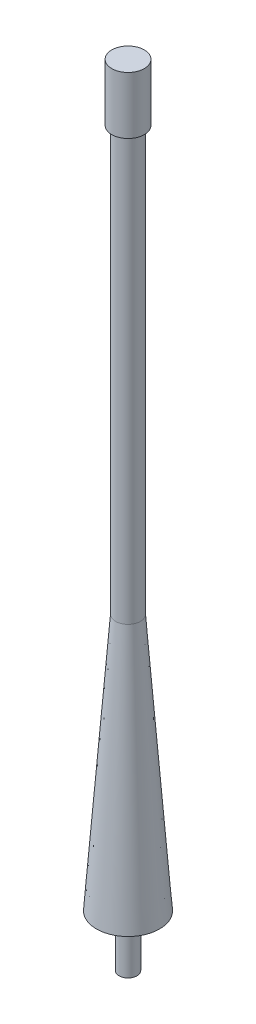
ISO-10303-21;
HEADER;
FILE_DESCRIPTION(('STEP AP214'),'2;1');
FILE_NAME('part.step','',(''),(''),'','','');
FILE_SCHEMA(('AUTOMOTIVE_DESIGN { 1 0 10303 214 1 1 1 1 }'));
ENDSEC;
DATA;
#1=APPLICATION_CONTEXT('core data for automotive mechanical design processes');
#2=APPLICATION_PROTOCOL_DEFINITION('international standard','automotive_design',2000,#1);
#3=PRODUCT_CONTEXT('',#1,'mechanical');
#4=PRODUCT('Part','Part','',(#3));
#5=PRODUCT_RELATED_PRODUCT_CATEGORY('part','',(#4));
#6=PRODUCT_DEFINITION_FORMATION('','',#4);
#7=PRODUCT_DEFINITION_CONTEXT('part definition',#1,'design');
#8=PRODUCT_DEFINITION('design','',#6,#7);
#9=PRODUCT_DEFINITION_SHAPE('','',#8);
#10=(LENGTH_UNIT() NAMED_UNIT(*) SI_UNIT(.MILLI.,.METRE.));
#11=(NAMED_UNIT(*) PLANE_ANGLE_UNIT() SI_UNIT($,.RADIAN.));
#12=(NAMED_UNIT(*) SI_UNIT($,.STERADIAN.) SOLID_ANGLE_UNIT());
#13=UNCERTAINTY_MEASURE_WITH_UNIT(LENGTH_MEASURE(1.E-05),#10,'distance_accuracy_value','');
#14=(GEOMETRIC_REPRESENTATION_CONTEXT(3) GLOBAL_UNCERTAINTY_ASSIGNED_CONTEXT((#13)) GLOBAL_UNIT_ASSIGNED_CONTEXT((#10,
#11,#12)) REPRESENTATION_CONTEXT('',''));
#15=CARTESIAN_POINT('',(0.,0.,0.));
#16=DIRECTION('',(0.,0.,1.));
#17=DIRECTION('',(1.,0.,0.));
#18=AXIS2_PLACEMENT_3D('',#15,#16,#17);
#19=CARTESIAN_POINT('',(-1.80000000000005,175.2,0.));
#20=DIRECTION('',(0.,1.,0.));
#21=DIRECTION('',(0.,0.,1.));
#22=AXIS2_PLACEMENT_3D('',#19,#20,#21);
#23=PLANE('',#22);
#24=CARTESIAN_POINT('',(0.,175.2,0.));
#25=DIRECTION('',(0.,1.,0.));
#26=DIRECTION('',(-1.,0.,0.));
#27=AXIS2_PLACEMENT_3D('',#24,#25,#26);
#28=CIRCLE('',#27,3.59999999999999);
#29=CARTESIAN_POINT('',(-3.60000000000004,175.2,0.));
#30=VERTEX_POINT('',#29);
#31=EDGE_CURVE('E18',#30,#30,#28,.F.);
#32=ORIENTED_EDGE('',*,*,#31,.F.);
#33=EDGE_LOOP('',(#32));
#34=FACE_BOUND('',#33,.T.);
#35=ADVANCED_FACE('F15',(#34),#23,.T.);
#36=CARTESIAN_POINT('',(0.,168.85,0.));
#37=DIRECTION('',(0.,1.,0.));
#38=DIRECTION('',(-1.,0.,0.));
#39=AXIS2_PLACEMENT_3D('',#36,#37,#38);
#40=CYLINDRICAL_SURFACE('',#39,3.59999999999999);
#41=CARTESIAN_POINT('',(0.,162.5,0.));
#42=DIRECTION('',(0.,1.,0.));
#43=DIRECTION('',(-1.,0.,0.));
#44=AXIS2_PLACEMENT_3D('',#41,#42,#43);
#45=CIRCLE('',#44,3.59999999999999);
#46=CARTESIAN_POINT('',(-3.60000000000004,162.5,0.));
#47=VERTEX_POINT('',#46);
#48=EDGE_CURVE('E39',#47,#47,#45,.F.);
#49=ORIENTED_EDGE('',*,*,#48,.F.);
#50=EDGE_LOOP('',(#49));
#51=FACE_BOUND('',#50,.T.);
#52=ORIENTED_EDGE('',*,*,#31,.T.);
#53=EDGE_LOOP('',(#52));
#54=FACE_BOUND('',#53,.T.);
#55=ADVANCED_FACE('F46',(#51,#54),#40,.T.);
#56=CARTESIAN_POINT('',(-1.,0.,0.));
#57=DIRECTION('',(0.,-1.,0.));
#58=DIRECTION('',(0.,0.,-1.));
#59=AXIS2_PLACEMENT_3D('',#56,#57,#58);
#60=PLANE('',#59);
#61=CARTESIAN_POINT('',(0.,0.,0.));
#62=DIRECTION('',(0.,1.,0.));
#63=DIRECTION('',(-1.,0.,0.));
#64=AXIS2_PLACEMENT_3D('',#61,#62,#63);
#65=CIRCLE('',#64,2.);
#66=CARTESIAN_POINT('',(-2.,0.,0.));
#67=VERTEX_POINT('',#66);
#68=EDGE_CURVE('E37',#67,#67,#65,.T.);
#69=ORIENTED_EDGE('',*,*,#68,.F.);
#70=EDGE_LOOP('',(#69));
#71=FACE_BOUND('',#70,.T.);
#72=ADVANCED_FACE('F53',(#71),#60,.T.);
#73=CARTESIAN_POINT('',(-3.17500000000004,162.5,0.));
#74=DIRECTION('',(0.,-1.,0.));
#75=DIRECTION('',(0.,0.,-1.));
#76=AXIS2_PLACEMENT_3D('',#73,#74,#75);
#77=PLANE('',#76);
#78=CARTESIAN_POINT('',(0.,162.5,0.));
#79=DIRECTION('',(0.,1.,0.));
#80=DIRECTION('',(-1.,0.,0.));
#81=AXIS2_PLACEMENT_3D('',#78,#79,#80);
#82=CIRCLE('',#81,2.75);
#83=CARTESIAN_POINT('',(-2.75000000000004,162.5,0.));
#84=VERTEX_POINT('',#83);
#85=EDGE_CURVE('E34',#84,#84,#82,.F.);
#86=ORIENTED_EDGE('',*,*,#85,.F.);
#87=EDGE_LOOP('',(#86));
#88=FACE_BOUND('',#87,.T.);
#89=ORIENTED_EDGE('',*,*,#48,.T.);
#90=EDGE_LOOP('',(#89));
#91=FACE_BOUND('',#90,.T.);
#92=ADVANCED_FACE('F73',(#88,#91),#77,.T.);
#93=CARTESIAN_POINT('',(0.,5.75,0.));
#94=DIRECTION('',(0.,1.,0.));
#95=DIRECTION('',(-1.,0.,0.));
#96=AXIS2_PLACEMENT_3D('',#93,#94,#95);
#97=CYLINDRICAL_SURFACE('',#96,2.);
#98=ORIENTED_EDGE('',*,*,#68,.T.);
#99=EDGE_LOOP('',(#98));
#100=FACE_BOUND('',#99,.T.);
#101=CARTESIAN_POINT('',(0.,11.5,0.));
#102=DIRECTION('',(0.,1.,0.));
#103=DIRECTION('',(-1.,0.,0.));
#104=AXIS2_PLACEMENT_3D('',#101,#102,#103);
#105=CIRCLE('',#104,2.);
#106=CARTESIAN_POINT('',(-2.,11.5,0.));
#107=VERTEX_POINT('',#106);
#108=EDGE_CURVE('E27',#107,#107,#105,.T.);
#109=ORIENTED_EDGE('',*,*,#108,.F.);
#110=EDGE_LOOP('',(#109));
#111=FACE_BOUND('',#110,.T.);
#112=ADVANCED_FACE('F69',(#100,#111),#97,.T.);
#113=CARTESIAN_POINT('',(0.,115.5,0.));
#114=DIRECTION('',(0.,1.,0.));
#115=DIRECTION('',(-1.,0.,0.));
#116=AXIS2_PLACEMENT_3D('',#113,#114,#115);
#117=CYLINDRICAL_SURFACE('',#116,2.75);
#118=CARTESIAN_POINT('',(0.,68.5000000001992,0.));
#119=DIRECTION('',(0.,-1.,0.));
#120=DIRECTION('',(-1.,0.,0.));
#121=AXIS2_PLACEMENT_3D('',#118,#119,#120);
#122=CIRCLE('',#121,2.75000000242185);
#123=CARTESIAN_POINT('',(-2.75000000242187,68.5000000001992,0.));
#124=VERTEX_POINT('',#123);
#125=EDGE_CURVE('E22',#124,#124,#122,.T.);
#126=ORIENTED_EDGE('',*,*,#125,.F.);
#127=EDGE_LOOP('',(#126));
#128=FACE_BOUND('',#127,.T.);
#129=ORIENTED_EDGE('',*,*,#85,.T.);
#130=EDGE_LOOP('',(#129));
#131=FACE_BOUND('',#130,.T.);
#132=ADVANCED_FACE('F62',(#128,#131),#117,.T.);
#133=CARTESIAN_POINT('',(-4.5,11.5,0.));
#134=DIRECTION('',(0.,-1.,0.));
#135=DIRECTION('',(0.,0.,-1.));
#136=AXIS2_PLACEMENT_3D('',#133,#134,#135);
#137=PLANE('',#136);
#138=ORIENTED_EDGE('',*,*,#108,.T.);
#139=EDGE_LOOP('',(#138));
#140=FACE_BOUND('',#139,.T.);
#141=CARTESIAN_POINT('',(0.,11.4999999998417,0.));
#142=DIRECTION('',(0.,-1.,0.));
#143=DIRECTION('',(1.,0.,0.));
#144=AXIS2_PLACEMENT_3D('',#141,#142,#143);
#145=CIRCLE('',#144,6.99999999757345);
#146=CARTESIAN_POINT('',(6.99999999757344,11.4999999998418,0.));
#147=VERTEX_POINT('',#146);
#148=EDGE_CURVE('E10',#147,#147,#145,.F.);
#149=ORIENTED_EDGE('',*,*,#148,.F.);
#150=EDGE_LOOP('',(#149));
#151=FACE_BOUND('',#150,.T.);
#152=ADVANCED_FACE('F57',(#140,#151),#137,.T.);
#153=CARTESIAN_POINT('',(0.,11.5000000000123,0.));
#154=DIRECTION('',(0.,-1.,0.));
#155=DIRECTION('',(1.,0.,0.));
#156=AXIS2_PLACEMENT_3D('',#153,#154,#155);
#157=CONICAL_SURFACE('',#156,6.99999999756073,0.0744236902005052);
#158=ORIENTED_EDGE('',*,*,#148,.T.);
#159=EDGE_LOOP('',(#158));
#160=FACE_BOUND('',#159,.T.);
#161=ORIENTED_EDGE('',*,*,#125,.T.);
#162=EDGE_LOOP('',(#161));
#163=FACE_BOUND('',#162,.T.);
#164=ADVANCED_FACE('F55',(#160,#163),#157,.T.);
#165=CLOSED_SHELL('',(#35,#55,#72,#92,#112,#132,#152,#164));
#166=MANIFOLD_SOLID_BREP('B1',#165);
#167=ADVANCED_BREP_SHAPE_REPRESENTATION('',(#18,#166),#14);
#168=SHAPE_DEFINITION_REPRESENTATION(#9,#167);
ENDSEC;
END-ISO-10303-21;
